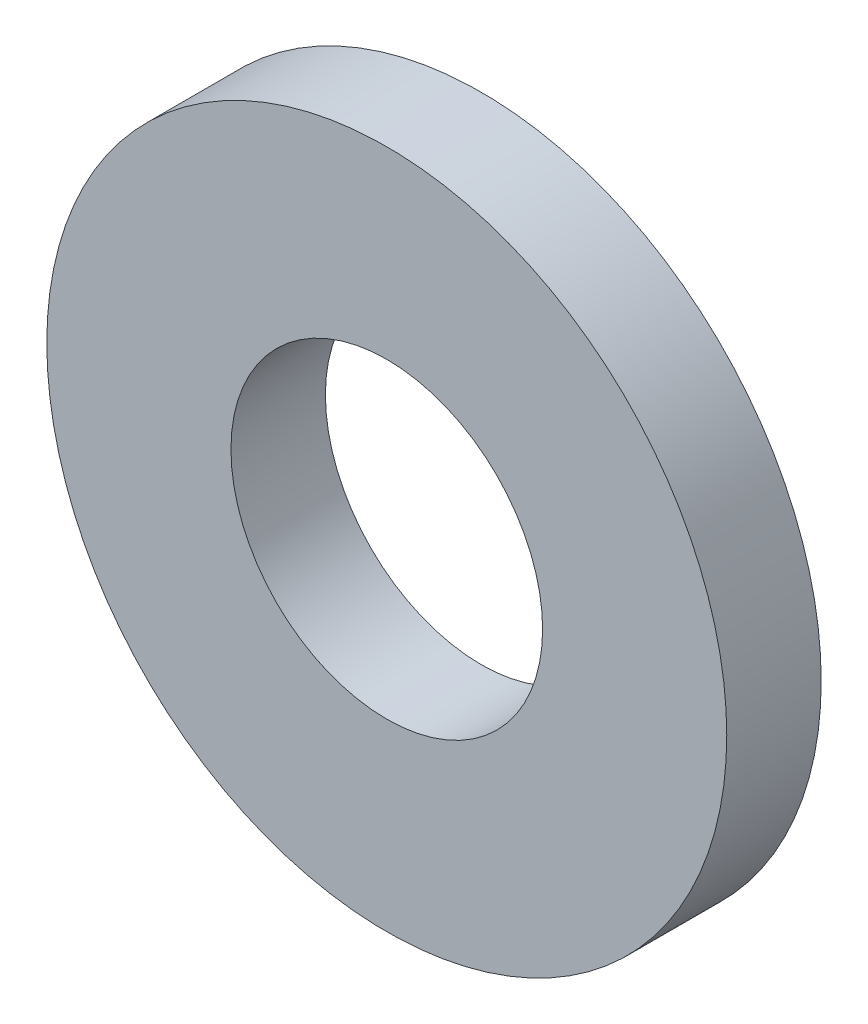
ISO-10303-21;
HEADER;
FILE_DESCRIPTION(('STEP AP214'),'2;1');
FILE_NAME('part.step','',(''),(''),'','','');
FILE_SCHEMA(('AUTOMOTIVE_DESIGN { 1 0 10303 214 1 1 1 1 }'));
ENDSEC;
DATA;
#1=APPLICATION_CONTEXT('core data for automotive mechanical design processes');
#2=APPLICATION_PROTOCOL_DEFINITION('international standard','automotive_design',2000,#1);
#3=PRODUCT_CONTEXT('',#1,'mechanical');
#4=PRODUCT('Part','Part','',(#3));
#5=PRODUCT_RELATED_PRODUCT_CATEGORY('part','',(#4));
#6=PRODUCT_DEFINITION_FORMATION('','',#4);
#7=PRODUCT_DEFINITION_CONTEXT('part definition',#1,'design');
#8=PRODUCT_DEFINITION('design','',#6,#7);
#9=PRODUCT_DEFINITION_SHAPE('','',#8);
#10=(LENGTH_UNIT() NAMED_UNIT(*) SI_UNIT(.MILLI.,.METRE.));
#11=(NAMED_UNIT(*) PLANE_ANGLE_UNIT() SI_UNIT($,.RADIAN.));
#12=(NAMED_UNIT(*) SI_UNIT($,.STERADIAN.) SOLID_ANGLE_UNIT());
#13=UNCERTAINTY_MEASURE_WITH_UNIT(LENGTH_MEASURE(1.E-05),#10,'distance_accuracy_value','');
#14=(GEOMETRIC_REPRESENTATION_CONTEXT(3) GLOBAL_UNCERTAINTY_ASSIGNED_CONTEXT((#13)) GLOBAL_UNIT_ASSIGNED_CONTEXT((#10,
#11,#12)) REPRESENTATION_CONTEXT('',''));
#15=CARTESIAN_POINT('',(0.,0.,0.));
#16=DIRECTION('',(0.,0.,1.));
#17=DIRECTION('',(1.,0.,0.));
#18=AXIS2_PLACEMENT_3D('',#15,#16,#17);
#19=CARTESIAN_POINT('',(0.,0.,1.));
#20=DIRECTION('',(0.,0.,1.));
#21=DIRECTION('',(1.,0.,0.));
#22=AXIS2_PLACEMENT_3D('',#19,#20,#21);
#23=PLANE('',#22);
#24=CARTESIAN_POINT('',(0.,0.,1.));
#25=DIRECTION('',(0.,0.,1.));
#26=DIRECTION('',(1.,0.,0.));
#27=AXIS2_PLACEMENT_3D('',#24,#25,#26);
#28=CIRCLE('',#27,3.6);
#29=CARTESIAN_POINT('',(3.6,0.,1.));
#30=VERTEX_POINT('',#29);
#31=EDGE_CURVE('E10',#30,#30,#28,.T.);
#32=ORIENTED_EDGE('',*,*,#31,.T.);
#33=EDGE_LOOP('',(#32));
#34=FACE_BOUND('',#33,.T.);
#35=CARTESIAN_POINT('',(0.,0.,1.));
#36=DIRECTION('',(0.,0.,1.));
#37=DIRECTION('',(1.,0.,0.));
#38=AXIS2_PLACEMENT_3D('',#35,#36,#37);
#39=CIRCLE('',#38,1.65);
#40=CARTESIAN_POINT('',(1.65,0.,1.));
#41=VERTEX_POINT('',#40);
#42=EDGE_CURVE('E54',#41,#41,#39,.T.);
#43=ORIENTED_EDGE('',*,*,#42,.F.);
#44=EDGE_LOOP('',(#43));
#45=FACE_BOUND('',#44,.T.);
#46=ADVANCED_FACE('F41',(#34,#45),#23,.T.);
#47=CARTESIAN_POINT('',(0.,0.,0.));
#48=DIRECTION('',(0.,0.,1.));
#49=DIRECTION('',(1.,0.,0.));
#50=AXIS2_PLACEMENT_3D('',#47,#48,#49);
#51=PLANE('',#50);
#52=CARTESIAN_POINT('',(0.,0.,0.));
#53=DIRECTION('',(0.,0.,1.));
#54=DIRECTION('',(1.,0.,0.));
#55=AXIS2_PLACEMENT_3D('',#52,#53,#54);
#56=CIRCLE('',#55,3.6);
#57=CARTESIAN_POINT('',(3.6,0.,0.));
#58=VERTEX_POINT('',#57);
#59=EDGE_CURVE('E45',#58,#58,#56,.T.);
#60=ORIENTED_EDGE('',*,*,#59,.F.);
#61=EDGE_LOOP('',(#60));
#62=FACE_BOUND('',#61,.T.);
#63=CARTESIAN_POINT('',(0.,0.,0.));
#64=DIRECTION('',(0.,0.,1.));
#65=DIRECTION('',(1.,0.,0.));
#66=AXIS2_PLACEMENT_3D('',#63,#64,#65);
#67=CIRCLE('',#66,1.65);
#68=CARTESIAN_POINT('',(1.65,0.,0.));
#69=VERTEX_POINT('',#68);
#70=EDGE_CURVE('E56',#69,#69,#67,.T.);
#71=ORIENTED_EDGE('',*,*,#70,.T.);
#72=EDGE_LOOP('',(#71));
#73=FACE_BOUND('',#72,.T.);
#74=ADVANCED_FACE('F68',(#62,#73),#51,.F.);
#75=CARTESIAN_POINT('',(0.,0.,1.));
#76=DIRECTION('',(0.,0.,-1.));
#77=DIRECTION('',(-1.,0.,0.));
#78=AXIS2_PLACEMENT_3D('',#75,#76,#77);
#79=CYLINDRICAL_SURFACE('',#78,3.6);
#80=ORIENTED_EDGE('',*,*,#31,.F.);
#81=EDGE_LOOP('',(#80));
#82=FACE_BOUND('',#81,.T.);
#83=ORIENTED_EDGE('',*,*,#59,.T.);
#84=EDGE_LOOP('',(#83));
#85=FACE_BOUND('',#84,.T.);
#86=ADVANCED_FACE('F43',(#82,#85),#79,.T.);
#87=CARTESIAN_POINT('',(0.,0.,1.));
#88=DIRECTION('',(0.,0.,-1.));
#89=DIRECTION('',(-1.,0.,0.));
#90=AXIS2_PLACEMENT_3D('',#87,#88,#89);
#91=CYLINDRICAL_SURFACE('',#90,1.65);
#92=ORIENTED_EDGE('',*,*,#42,.T.);
#93=EDGE_LOOP('',(#92));
#94=FACE_BOUND('',#93,.T.);
#95=ORIENTED_EDGE('',*,*,#70,.F.);
#96=EDGE_LOOP('',(#95));
#97=FACE_BOUND('',#96,.T.);
#98=ADVANCED_FACE('F64',(#94,#97),#91,.F.);
#99=CLOSED_SHELL('',(#46,#74,#86,#98));
#100=MANIFOLD_SOLID_BREP('B2',#99);
#101=ADVANCED_BREP_SHAPE_REPRESENTATION('',(#18,#100),#14);
#102=SHAPE_DEFINITION_REPRESENTATION(#9,#101);
ENDSEC;
END-ISO-10303-21;
